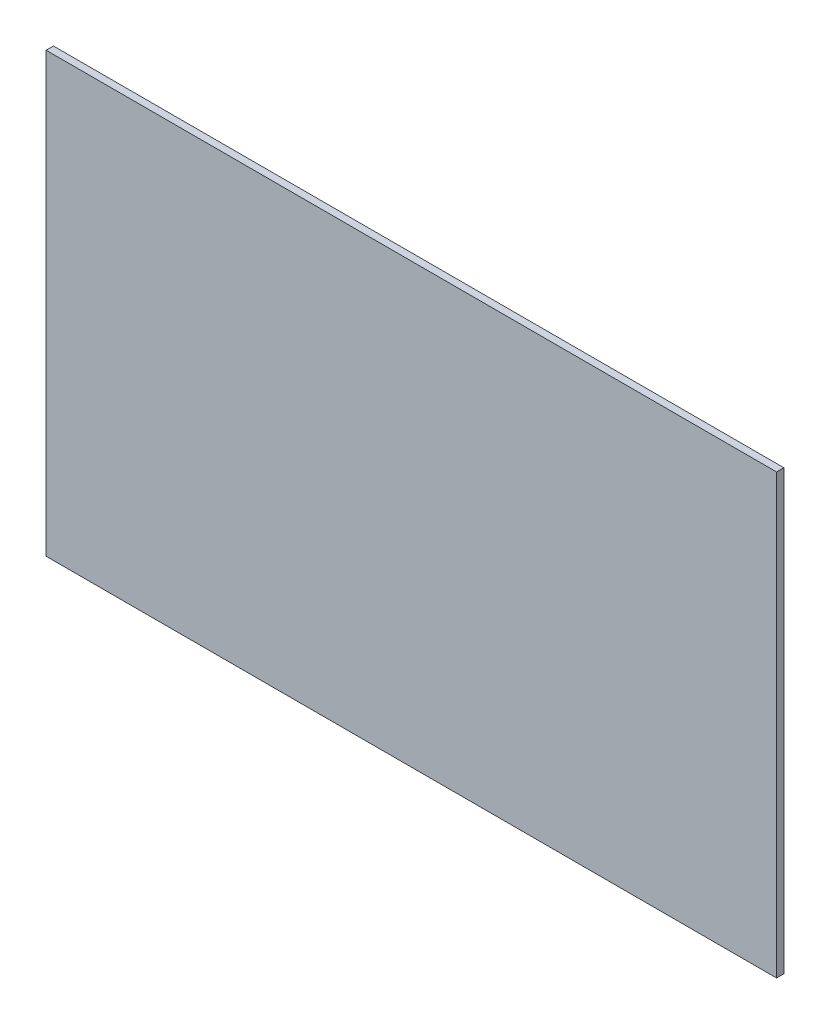
ISO-10303-21;
HEADER;
FILE_DESCRIPTION(('STEP AP214'),'2;1');
FILE_NAME('part.step','',(''),(''),'','','');
FILE_SCHEMA(('AUTOMOTIVE_DESIGN { 1 0 10303 214 1 1 1 1 }'));
ENDSEC;
DATA;
#1=APPLICATION_CONTEXT('core data for automotive mechanical design processes');
#2=APPLICATION_PROTOCOL_DEFINITION('international standard','automotive_design',2000,#1);
#3=PRODUCT_CONTEXT('',#1,'mechanical');
#4=PRODUCT('Part','Part','',(#3));
#5=PRODUCT_RELATED_PRODUCT_CATEGORY('part','',(#4));
#6=PRODUCT_DEFINITION_FORMATION('','',#4);
#7=PRODUCT_DEFINITION_CONTEXT('part definition',#1,'design');
#8=PRODUCT_DEFINITION('design','',#6,#7);
#9=PRODUCT_DEFINITION_SHAPE('','',#8);
#10=(LENGTH_UNIT() NAMED_UNIT(*) SI_UNIT(.MILLI.,.METRE.));
#11=(NAMED_UNIT(*) PLANE_ANGLE_UNIT() SI_UNIT($,.RADIAN.));
#12=(NAMED_UNIT(*) SI_UNIT($,.STERADIAN.) SOLID_ANGLE_UNIT());
#13=UNCERTAINTY_MEASURE_WITH_UNIT(LENGTH_MEASURE(1.E-05),#10,'distance_accuracy_value','');
#14=(GEOMETRIC_REPRESENTATION_CONTEXT(3) GLOBAL_UNCERTAINTY_ASSIGNED_CONTEXT((#13)) GLOBAL_UNIT_ASSIGNED_CONTEXT((#10,
#11,#12)) REPRESENTATION_CONTEXT('',''));
#15=CARTESIAN_POINT('',(0.,0.,0.));
#16=DIRECTION('',(0.,0.,1.));
#17=DIRECTION('',(1.,0.,0.));
#18=AXIS2_PLACEMENT_3D('',#15,#16,#17);
#19=CARTESIAN_POINT('',(-250.,-150.,5.));
#20=DIRECTION('',(1.,0.,0.));
#21=DIRECTION('',(0.,0.,-1.));
#22=AXIS2_PLACEMENT_3D('',#19,#20,#21);
#23=PLANE('',#22);
#24=DIRECTION('',(0.,-1.,0.));
#25=VECTOR('',#24,1.);
#26=CARTESIAN_POINT('',(-250.,-150.,0.));
#27=LINE('',#26,#25);
#28=CARTESIAN_POINT('',(-250.,150.,0.));
#29=VERTEX_POINT('',#28);
#30=CARTESIAN_POINT('',(-250.,-150.,0.));
#31=VERTEX_POINT('',#30);
#32=EDGE_CURVE('E96',#29,#31,#27,.T.);
#33=ORIENTED_EDGE('',*,*,#32,.T.);
#34=DIRECTION('',(0.,0.,-1.));
#35=VECTOR('',#34,1.);
#36=CARTESIAN_POINT('',(-250.,-150.,5.));
#37=LINE('',#36,#35);
#38=CARTESIAN_POINT('',(-250.,-150.,5.));
#39=VERTEX_POINT('',#38);
#40=EDGE_CURVE('E11',#39,#31,#37,.T.);
#41=ORIENTED_EDGE('',*,*,#40,.F.);
#42=DIRECTION('',(0.,-1.,0.));
#43=VECTOR('',#42,1.);
#44=CARTESIAN_POINT('',(-250.,-150.,5.));
#45=LINE('',#44,#43);
#46=CARTESIAN_POINT('',(-250.,150.,5.));
#47=VERTEX_POINT('',#46);
#48=EDGE_CURVE('E84',#47,#39,#45,.T.);
#49=ORIENTED_EDGE('',*,*,#48,.F.);
#50=DIRECTION('',(0.,0.,-1.));
#51=VECTOR('',#50,1.);
#52=CARTESIAN_POINT('',(-250.,150.,5.));
#53=LINE('',#52,#51);
#54=EDGE_CURVE('E92',#47,#29,#53,.T.);
#55=ORIENTED_EDGE('',*,*,#54,.T.);
#56=EDGE_LOOP('',(#33,#41,#49,#55));
#57=FACE_BOUND('',#56,.T.);
#58=ADVANCED_FACE('F33',(#57),#23,.F.);
#59=CARTESIAN_POINT('',(250.,-150.,5.));
#60=DIRECTION('',(0.,1.,0.));
#61=DIRECTION('',(-1.,0.,0.));
#62=AXIS2_PLACEMENT_3D('',#59,#60,#61);
#63=PLANE('',#62);
#64=DIRECTION('',(1.,0.,0.));
#65=VECTOR('',#64,1.);
#66=CARTESIAN_POINT('',(250.,-150.,0.));
#67=LINE('',#66,#65);
#68=CARTESIAN_POINT('',(250.,-150.,0.));
#69=VERTEX_POINT('',#68);
#70=EDGE_CURVE('E88',#31,#69,#67,.T.);
#71=ORIENTED_EDGE('',*,*,#70,.T.);
#72=DIRECTION('',(0.,0.,-1.));
#73=VECTOR('',#72,1.);
#74=CARTESIAN_POINT('',(250.,-150.,5.));
#75=LINE('',#74,#73);
#76=CARTESIAN_POINT('',(250.,-150.,5.));
#77=VERTEX_POINT('',#76);
#78=EDGE_CURVE('E41',#77,#69,#75,.T.);
#79=ORIENTED_EDGE('',*,*,#78,.F.);
#80=DIRECTION('',(1.,0.,0.));
#81=VECTOR('',#80,1.);
#82=CARTESIAN_POINT('',(250.,-150.,5.));
#83=LINE('',#82,#81);
#84=EDGE_CURVE('E79',#39,#77,#83,.T.);
#85=ORIENTED_EDGE('',*,*,#84,.F.);
#86=ORIENTED_EDGE('',*,*,#40,.T.);
#87=EDGE_LOOP('',(#71,#79,#85,#86));
#88=FACE_BOUND('',#87,.T.);
#89=ADVANCED_FACE('F87',(#88),#63,.F.);
#90=CARTESIAN_POINT('',(250.,-150.,5.));
#91=DIRECTION('',(-1.,0.,0.));
#92=DIRECTION('',(0.,-1.,0.));
#93=AXIS2_PLACEMENT_3D('',#90,#91,#92);
#94=PLANE('',#93);
#95=DIRECTION('',(0.,1.,0.));
#96=VECTOR('',#95,1.);
#97=CARTESIAN_POINT('',(250.,-150.,0.));
#98=LINE('',#97,#96);
#99=CARTESIAN_POINT('',(250.,150.,0.));
#100=VERTEX_POINT('',#99);
#101=EDGE_CURVE('E66',#69,#100,#98,.T.);
#102=ORIENTED_EDGE('',*,*,#101,.T.);
#103=DIRECTION('',(0.,0.,-1.));
#104=VECTOR('',#103,1.);
#105=CARTESIAN_POINT('',(250.,150.,5.));
#106=LINE('',#105,#104);
#107=CARTESIAN_POINT('',(250.,150.,5.));
#108=VERTEX_POINT('',#107);
#109=EDGE_CURVE('E89',#108,#100,#106,.T.);
#110=ORIENTED_EDGE('',*,*,#109,.F.);
#111=DIRECTION('',(0.,1.,0.));
#112=VECTOR('',#111,1.);
#113=CARTESIAN_POINT('',(250.,-150.,5.));
#114=LINE('',#113,#112);
#115=EDGE_CURVE('E82',#77,#108,#114,.T.);
#116=ORIENTED_EDGE('',*,*,#115,.F.);
#117=ORIENTED_EDGE('',*,*,#78,.T.);
#118=EDGE_LOOP('',(#102,#110,#116,#117));
#119=FACE_BOUND('',#118,.T.);
#120=ADVANCED_FACE('F90',(#119),#94,.F.);
#121=CARTESIAN_POINT('',(250.,150.,5.));
#122=DIRECTION('',(0.,-1.,0.));
#123=DIRECTION('',(1.,0.,0.));
#124=AXIS2_PLACEMENT_3D('',#121,#122,#123);
#125=PLANE('',#124);
#126=DIRECTION('',(-1.,0.,0.));
#127=VECTOR('',#126,1.);
#128=CARTESIAN_POINT('',(250.,150.,0.));
#129=LINE('',#128,#127);
#130=EDGE_CURVE('E72',#100,#29,#129,.T.);
#131=ORIENTED_EDGE('',*,*,#130,.T.);
#132=ORIENTED_EDGE('',*,*,#54,.F.);
#133=DIRECTION('',(-1.,0.,0.));
#134=VECTOR('',#133,1.);
#135=CARTESIAN_POINT('',(250.,150.,5.));
#136=LINE('',#135,#134);
#137=EDGE_CURVE('E49',#108,#47,#136,.T.);
#138=ORIENTED_EDGE('',*,*,#137,.F.);
#139=ORIENTED_EDGE('',*,*,#109,.T.);
#140=EDGE_LOOP('',(#131,#132,#138,#139));
#141=FACE_BOUND('',#140,.T.);
#142=ADVANCED_FACE('F103',(#141),#125,.F.);
#143=CARTESIAN_POINT('',(0.,0.,5.));
#144=DIRECTION('',(0.,0.,1.));
#145=DIRECTION('',(1.,0.,0.));
#146=AXIS2_PLACEMENT_3D('',#143,#144,#145);
#147=PLANE('',#146);
#148=ORIENTED_EDGE('',*,*,#48,.T.);
#149=ORIENTED_EDGE('',*,*,#84,.T.);
#150=ORIENTED_EDGE('',*,*,#115,.T.);
#151=ORIENTED_EDGE('',*,*,#137,.T.);
#152=EDGE_LOOP('',(#148,#149,#150,#151));
#153=FACE_BOUND('',#152,.T.);
#154=ADVANCED_FACE('F80',(#153),#147,.T.);
#155=CARTESIAN_POINT('',(0.,0.,0.));
#156=DIRECTION('',(0.,0.,1.));
#157=DIRECTION('',(1.,0.,0.));
#158=AXIS2_PLACEMENT_3D('',#155,#156,#157);
#159=PLANE('',#158);
#160=ORIENTED_EDGE('',*,*,#32,.F.);
#161=ORIENTED_EDGE('',*,*,#130,.F.);
#162=ORIENTED_EDGE('',*,*,#101,.F.);
#163=ORIENTED_EDGE('',*,*,#70,.F.);
#164=EDGE_LOOP('',(#160,#161,#162,#163));
#165=FACE_BOUND('',#164,.T.);
#166=ADVANCED_FACE('F106',(#165),#159,.F.);
#167=CLOSED_SHELL('',(#58,#89,#120,#142,#154,#166));
#168=MANIFOLD_SOLID_BREP('B2',#167);
#169=ADVANCED_BREP_SHAPE_REPRESENTATION('',(#18,#168),#14);
#170=SHAPE_DEFINITION_REPRESENTATION(#9,#169);
ENDSEC;
END-ISO-10303-21;
